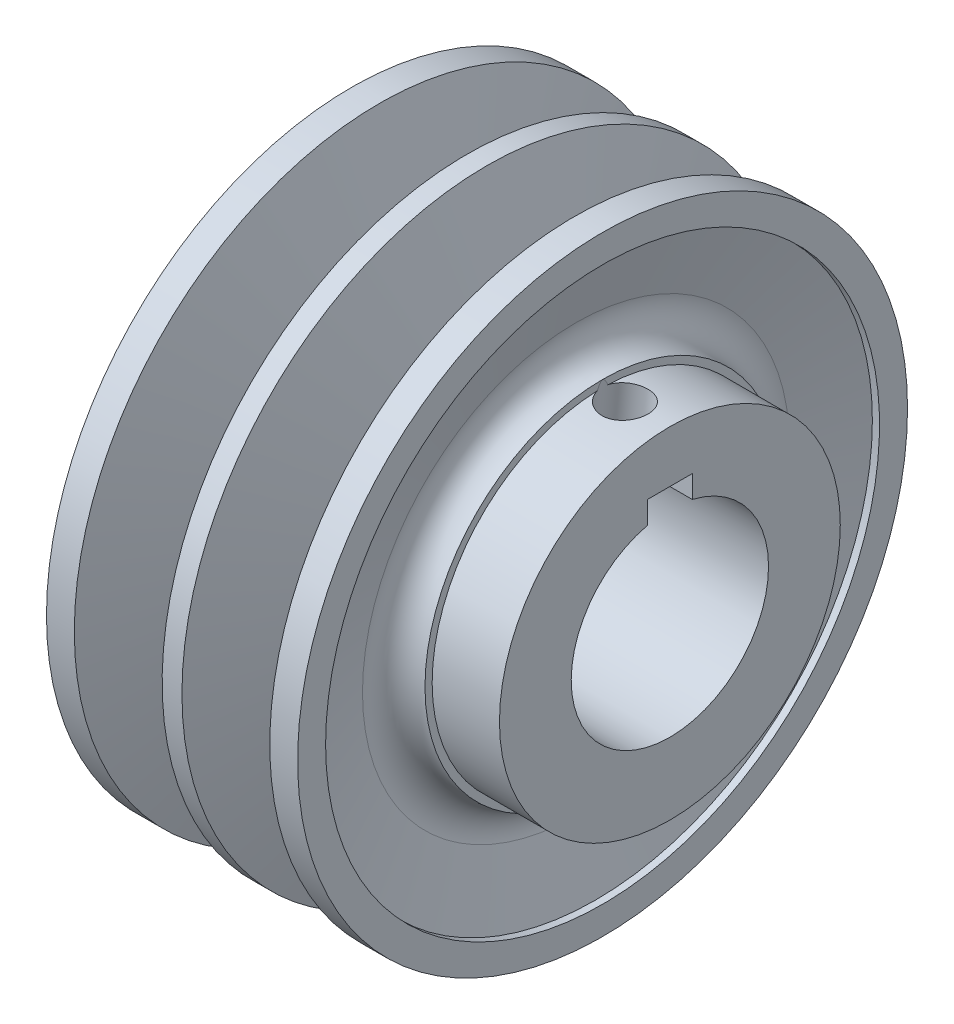
ISO-10303-21;
HEADER;
FILE_DESCRIPTION(('STEP AP214'),'2;1');
FILE_NAME('part.step','',(''),(''),'','','');
FILE_SCHEMA(('AUTOMOTIVE_DESIGN { 1 0 10303 214 1 1 1 1 }'));
ENDSEC;
DATA;
#1=APPLICATION_CONTEXT('core data for automotive mechanical design processes');
#2=APPLICATION_PROTOCOL_DEFINITION('international standard','automotive_design',2000,#1);
#3=PRODUCT_CONTEXT('',#1,'mechanical');
#4=PRODUCT('Part','Part','',(#3));
#5=PRODUCT_RELATED_PRODUCT_CATEGORY('part','',(#4));
#6=PRODUCT_DEFINITION_FORMATION('','',#4);
#7=PRODUCT_DEFINITION_CONTEXT('part definition',#1,'design');
#8=PRODUCT_DEFINITION('design','',#6,#7);
#9=PRODUCT_DEFINITION_SHAPE('','',#8);
#10=(LENGTH_UNIT() NAMED_UNIT(*) SI_UNIT(.MILLI.,.METRE.));
#11=(NAMED_UNIT(*) PLANE_ANGLE_UNIT() SI_UNIT($,.RADIAN.));
#12=(NAMED_UNIT(*) SI_UNIT($,.STERADIAN.) SOLID_ANGLE_UNIT());
#13=UNCERTAINTY_MEASURE_WITH_UNIT(LENGTH_MEASURE(1.E-05),#10,'distance_accuracy_value','');
#14=(GEOMETRIC_REPRESENTATION_CONTEXT(3) GLOBAL_UNCERTAINTY_ASSIGNED_CONTEXT((#13)) GLOBAL_UNIT_ASSIGNED_CONTEXT((#10,
#11,#12)) REPRESENTATION_CONTEXT('',''));
#15=CARTESIAN_POINT('',(0.,0.,0.));
#16=DIRECTION('',(0.,0.,1.));
#17=DIRECTION('',(1.,0.,0.));
#18=AXIS2_PLACEMENT_3D('',#15,#16,#17);
#19=CARTESIAN_POINT('',(28.1813000000001,20.9742764454679,-3.96874999999997));
#20=DIRECTION('',(0.,1.,0.));
#21=DIRECTION('',(0.,0.,1.));
#22=AXIS2_PLACEMENT_3D('',#19,#20,#21);
#23=PLANE('',#22);
#24=DIRECTION('',(-1.,0.,0.));
#25=VECTOR('',#24,1.);
#26=CARTESIAN_POINT('',(28.1813000000001,20.9742764454679,-3.96874999999997));
#27=LINE('',#26,#25);
#28=CARTESIAN_POINT('',(-9.34036105443681,20.9742764454679,-3.96874999999997));
#29=VERTEX_POINT('',#28);
#30=CARTESIAN_POINT('',(18.561882287455,20.9742764454679,-3.96874999999997));
#31=VERTEX_POINT('',#30);
#32=EDGE_CURVE('E172',#29,#31,#27,.F.);
#33=ORIENTED_EDGE('',*,*,#32,.T.);
#34=CARTESIAN_POINT('',(19.4399346010358,20.9742764454679,0.));
#35=DIRECTION('',(0.,1.,0.));
#36=DIRECTION('',(1.,0.,0.));
#37=AXIS2_PLACEMENT_3D('',#34,#35,#36);
#38=ELLIPSE('',#37,4.07952381977618,4.06400000000001);
#39=CARTESIAN_POINT('',(18.561882287455,20.9742764454681,3.96875000000008));
#40=VERTEX_POINT('',#39);
#41=EDGE_CURVE('E121',#31,#40,#38,.T.);
#42=ORIENTED_EDGE('',*,*,#41,.T.);
#43=DIRECTION('',(1.,0.,0.));
#44=VECTOR('',#43,1.);
#45=CARTESIAN_POINT('',(28.1813,20.9742764454681,3.96875000000008));
#46=LINE('',#45,#44);
#47=CARTESIAN_POINT('',(-9.34036105443692,20.9742764454679,3.96875000000008));
#48=VERTEX_POINT('',#47);
#49=EDGE_CURVE('E138',#40,#48,#46,.F.);
#50=ORIENTED_EDGE('',*,*,#49,.T.);
#51=CARTESIAN_POINT('',(-9.34036105443693,20.9742764454679,3.96875000000008));
#52=CARTESIAN_POINT('',(-9.30817368593488,20.9742764454679,3.02643982037648));
#53=CARTESIAN_POINT('',(-9.292391892862,20.9742764454679,1.98463764473822));
#54=CARTESIAN_POINT('',(-9.27768482473013,20.9742764454679,1.01378119602618));
#55=CARTESIAN_POINT('',(-9.27768482473013,20.9742764454679,0.));
#56=CARTESIAN_POINT('',(-9.27768482473013,20.9742764454679,-1.01378119602609));
#57=CARTESIAN_POINT('',(-9.292391892862,20.9742764454679,-1.98463764473813));
#58=CARTESIAN_POINT('',(-9.30817368593488,20.9742764454679,-3.02643982037637));
#59=CARTESIAN_POINT('',(-9.34036105443693,20.9742764454679,-3.96874999999998));
#60=B_SPLINE_CURVE_WITH_KNOTS('',2,(#51,#52,#53,#54,#55,#56,#57,#58,#59),.UNSPECIFIED.,.F.,.F.,
(3,2,2,2,3),(0.,0.25,0.5,0.75,1.),.UNSPECIFIED.);
#61=EDGE_CURVE('E183',#48,#29,#60,.T.);
#62=ORIENTED_EDGE('',*,*,#61,.T.);
#63=EDGE_LOOP('',(#33,#42,#50,#62));
#64=FACE_BOUND('',#63,.T.);
#65=ADVANCED_FACE('F49',(#64),#23,.F.);
#66=CARTESIAN_POINT('',(-4.20370000000192,0.,0.));
#67=DIRECTION('',(-1.,0.,0.));
#68=DIRECTION('',(0.,0.,1.));
#69=AXIS2_PLACEMENT_3D('',#66,#67,#68);
#70=CONICAL_SURFACE('',#69,53.9749999999994,1.27409035395562);
#71=CARTESIAN_POINT('',(0.649774568156181,0.,0.));
#72=DIRECTION('',(-1.,0.,0.));
#73=DIRECTION('',(0.,0.,1.));
#74=AXIS2_PLACEMENT_3D('',#71,#72,#73);
#75=CIRCLE('',#74,38.1);
#76=CARTESIAN_POINT('',(0.649774568156181,0.,38.1000000000001));
#77=VERTEX_POINT('',#76);
#78=EDGE_CURVE('E421',#77,#77,#75,.F.);
#79=ORIENTED_EDGE('',*,*,#78,.F.);
#80=EDGE_LOOP('',(#79));
#81=FACE_BOUND('',#80,.T.);
#82=CARTESIAN_POINT('',(-4.20370000000003,0.,0.));
#83=DIRECTION('',(1.,0.,0.));
#84=DIRECTION('',(0.,0.,-1.));
#85=AXIS2_PLACEMENT_3D('',#82,#83,#84);
#86=CIRCLE('',#85,53.975);
#87=CARTESIAN_POINT('',(-4.20370000000003,0.,-53.9750000000001));
#88=VERTEX_POINT('',#87);
#89=EDGE_CURVE('E414',#88,#88,#86,.F.);
#90=ORIENTED_EDGE('',*,*,#89,.F.);
#91=EDGE_LOOP('',(#90));
#92=FACE_BOUND('',#91,.T.);
#93=ADVANCED_FACE('F350',(#81,#92),#70,.T.);
#94=CARTESIAN_POINT('',(-30.9994300000001,0.,0.));
#95=DIRECTION('',(1.,0.,0.));
#96=DIRECTION('',(0.,0.,-1.));
#97=AXIS2_PLACEMENT_3D('',#94,#95,#96);
#98=CYLINDRICAL_SURFACE('',#97,53.975);
#99=ORIENTED_EDGE('',*,*,#89,.T.);
#100=EDGE_LOOP('',(#99));
#101=FACE_BOUND('',#100,.T.);
#102=CARTESIAN_POINT('',(-7.70889999999735,0.,0.));
#103=DIRECTION('',(1.,0.,0.));
#104=DIRECTION('',(0.,-1.,0.));
#105=AXIS2_PLACEMENT_3D('',#102,#103,#104);
#106=CIRCLE('',#105,53.9749999999992);
#107=CARTESIAN_POINT('',(-7.70889999999735,-53.9749999999993,0.));
#108=VERTEX_POINT('',#107);
#109=EDGE_CURVE('E417',#108,#108,#106,.F.);
#110=ORIENTED_EDGE('',*,*,#109,.F.);
#111=EDGE_LOOP('',(#110));
#112=FACE_BOUND('',#111,.T.);
#113=ADVANCED_FACE('F354',(#101,#112),#98,.T.);
#114=CARTESIAN_POINT('',(30.9994300000001,0.,0.));
#115=DIRECTION('',(-1.,0.,0.));
#116=DIRECTION('',(0.,0.,1.));
#117=AXIS2_PLACEMENT_3D('',#114,#115,#116);
#118=CYLINDRICAL_SURFACE('',#117,38.1);
#119=ORIENTED_EDGE('',*,*,#78,.T.);
#120=EDGE_LOOP('',(#119));
#121=FACE_BOUND('',#120,.T.);
#122=CARTESIAN_POINT('',(6.48762543184245,0.,0.));
#123=DIRECTION('',(1.,0.,0.));
#124=DIRECTION('',(0.,-1.,0.));
#125=AXIS2_PLACEMENT_3D('',#122,#123,#124);
#126=CIRCLE('',#125,38.1000000000001);
#127=CARTESIAN_POINT('',(6.48762543184245,-38.1000000000002,0.));
#128=VERTEX_POINT('',#127);
#129=EDGE_CURVE('E420',#128,#128,#126,.T.);
#130=ORIENTED_EDGE('',*,*,#129,.F.);
#131=EDGE_LOOP('',(#130));
#132=FACE_BOUND('',#131,.T.);
#133=ADVANCED_FACE('F402',(#121,#132),#118,.T.);
#134=CARTESIAN_POINT('',(-7.70889999999735,0.,0.));
#135=DIRECTION('',(1.,0.,0.));
#136=DIRECTION('',(0.,0.,-1.));
#137=AXIS2_PLACEMENT_3D('',#134,#135,#136);
#138=CONICAL_SURFACE('',#137,53.9749999999992,1.27409035395562);
#139=CARTESIAN_POINT('',(-12.5623745681572,0.,0.));
#140=DIRECTION('',(-1.,0.,0.));
#141=DIRECTION('',(0.,0.,1.));
#142=AXIS2_PLACEMENT_3D('',#139,#140,#141);
#143=CIRCLE('',#142,38.1);
#144=CARTESIAN_POINT('',(-12.5623745681572,0.,38.1000000000001));
#145=VERTEX_POINT('',#144);
#146=EDGE_CURVE('E428',#145,#145,#143,.T.);
#147=ORIENTED_EDGE('',*,*,#146,.F.);
#148=EDGE_LOOP('',(#147));
#149=FACE_BOUND('',#148,.T.);
#150=ORIENTED_EDGE('',*,*,#109,.T.);
#151=EDGE_LOOP('',(#150));
#152=FACE_BOUND('',#151,.T.);
#153=ADVANCED_FACE('F398',(#149,#152),#138,.T.);
#154=CARTESIAN_POINT('',(11.3411000000027,0.,0.));
#155=DIRECTION('',(1.,0.,0.));
#156=DIRECTION('',(0.,0.,-1.));
#157=AXIS2_PLACEMENT_3D('',#154,#155,#156);
#158=CONICAL_SURFACE('',#157,53.9749999999992,1.27409035395562);
#159=ORIENTED_EDGE('',*,*,#129,.T.);
#160=EDGE_LOOP('',(#159));
#161=FACE_BOUND('',#160,.T.);
#162=CARTESIAN_POINT('',(11.3411,0.,0.));
#163=DIRECTION('',(1.,0.,0.));
#164=DIRECTION('',(0.,0.,-1.));
#165=AXIS2_PLACEMENT_3D('',#162,#163,#164);
#166=CIRCLE('',#165,53.975);
#167=CARTESIAN_POINT('',(11.3411,0.,-53.9750000000001));
#168=VERTEX_POINT('',#167);
#169=EDGE_CURVE('E539',#168,#168,#166,.T.);
#170=ORIENTED_EDGE('',*,*,#169,.F.);
#171=EDGE_LOOP('',(#170));
#172=FACE_BOUND('',#171,.T.);
#173=ADVANCED_FACE('F394',(#161,#172),#158,.T.);
#174=CARTESIAN_POINT('',(30.9994300000001,0.,0.));
#175=DIRECTION('',(-1.,0.,0.));
#176=DIRECTION('',(0.,0.,1.));
#177=AXIS2_PLACEMENT_3D('',#174,#175,#176);
#178=CYLINDRICAL_SURFACE('',#177,38.1);
#179=ORIENTED_EDGE('',*,*,#146,.T.);
#180=EDGE_LOOP('',(#179));
#181=FACE_BOUND('',#180,.T.);
#182=CARTESIAN_POINT('',(-18.4002254318425,1.11022302462516E-13,1.11022302462516E-13));
#183=DIRECTION('',(-1.,0.,0.));
#184=DIRECTION('',(0.,1.,0.));
#185=AXIS2_PLACEMENT_3D('',#182,#183,#184);
#186=CIRCLE('',#185,38.1000000000001);
#187=CARTESIAN_POINT('',(-18.4002254318425,38.1000000000003,1.13137277324427E-13));
#188=VERTEX_POINT('',#187);
#189=EDGE_CURVE('E530',#188,#188,#186,.T.);
#190=ORIENTED_EDGE('',*,*,#189,.F.);
#191=EDGE_LOOP('',(#190));
#192=FACE_BOUND('',#191,.T.);
#193=ADVANCED_FACE('F390',(#181,#192),#178,.T.);
#194=CARTESIAN_POINT('',(-30.9994300000001,0.,0.));
#195=DIRECTION('',(1.,0.,0.));
#196=DIRECTION('',(0.,0.,-1.));
#197=AXIS2_PLACEMENT_3D('',#194,#195,#196);
#198=CYLINDRICAL_SURFACE('',#197,53.975);
#199=CARTESIAN_POINT('',(16.2687,0.,0.));
#200=DIRECTION('',(1.,0.,0.));
#201=DIRECTION('',(0.,0.,-1.));
#202=AXIS2_PLACEMENT_3D('',#199,#200,#201);
#203=CIRCLE('',#202,53.975);
#204=CARTESIAN_POINT('',(16.2687,0.,-53.9750000000001));
#205=VERTEX_POINT('',#204);
#206=EDGE_CURVE('E520',#205,#205,#203,.F.);
#207=ORIENTED_EDGE('',*,*,#206,.T.);
#208=EDGE_LOOP('',(#207));
#209=FACE_BOUND('',#208,.T.);
#210=ORIENTED_EDGE('',*,*,#169,.T.);
#211=EDGE_LOOP('',(#210));
#212=FACE_BOUND('',#211,.T.);
#213=ADVANCED_FACE('F386',(#209,#212),#198,.T.);
#214=CARTESIAN_POINT('',(-23.2537000000026,0.,0.));
#215=DIRECTION('',(-1.,0.,0.));
#216=DIRECTION('',(0.,0.,1.));
#217=AXIS2_PLACEMENT_3D('',#214,#215,#216);
#218=CONICAL_SURFACE('',#217,53.9749999999992,1.27409035395562);
#219=ORIENTED_EDGE('',*,*,#189,.T.);
#220=EDGE_LOOP('',(#219));
#221=FACE_BOUND('',#220,.T.);
#222=CARTESIAN_POINT('',(-23.2537,0.,0.));
#223=DIRECTION('',(-1.,0.,0.));
#224=DIRECTION('',(0.,0.,1.));
#225=AXIS2_PLACEMENT_3D('',#222,#223,#224);
#226=CIRCLE('',#225,53.975);
#227=CARTESIAN_POINT('',(-23.2537,0.,53.9750000000001));
#228=VERTEX_POINT('',#227);
#229=EDGE_CURVE('E440',#228,#228,#226,.T.);
#230=ORIENTED_EDGE('',*,*,#229,.F.);
#231=EDGE_LOOP('',(#230));
#232=FACE_BOUND('',#231,.T.);
#233=ADVANCED_FACE('F382',(#221,#232),#218,.T.);
#234=CARTESIAN_POINT('',(16.2687,0.,0.));
#235=DIRECTION('',(-1.,0.,0.));
#236=DIRECTION('',(0.,0.,1.));
#237=AXIS2_PLACEMENT_3D('',#234,#235,#236);
#238=PLANE('',#237);
#239=CARTESIAN_POINT('',(16.2687,0.,0.));
#240=DIRECTION('',(-1.,0.,0.));
#241=DIRECTION('',(0.,0.,1.));
#242=AXIS2_PLACEMENT_3D('',#239,#240,#241);
#243=CIRCLE('',#242,49.022);
#244=CARTESIAN_POINT('',(16.2687,0.,49.0220000000001));
#245=VERTEX_POINT('',#244);
#246=EDGE_CURVE('E213',#245,#245,#243,.T.);
#247=ORIENTED_EDGE('',*,*,#246,.T.);
#248=EDGE_LOOP('',(#247));
#249=FACE_BOUND('',#248,.T.);
#250=ORIENTED_EDGE('',*,*,#206,.F.);
#251=EDGE_LOOP('',(#250));
#252=FACE_BOUND('',#251,.T.);
#253=ADVANCED_FACE('F378',(#249,#252),#238,.F.);
#254=CARTESIAN_POINT('',(18.4912,0.,0.));
#255=DIRECTION('',(-1.,0.,0.));
#256=DIRECTION('',(0.,0.,1.));
#257=AXIS2_PLACEMENT_3D('',#254,#255,#256);
#258=CYLINDRICAL_SURFACE('',#257,49.022);
#259=CARTESIAN_POINT('',(14.9987000000041,0.,0.));
#260=DIRECTION('',(1.,0.,0.));
#261=DIRECTION('',(0.,-1.,0.));
#262=AXIS2_PLACEMENT_3D('',#259,#260,#261);
#263=CIRCLE('',#262,49.0219999999987);
#264=CARTESIAN_POINT('',(14.9987000000041,-49.0219999999988,0.));
#265=VERTEX_POINT('',#264);
#266=EDGE_CURVE('E537',#265,#265,#263,.F.);
#267=ORIENTED_EDGE('',*,*,#266,.T.);
#268=EDGE_LOOP('',(#267));
#269=FACE_BOUND('',#268,.T.);
#270=ORIENTED_EDGE('',*,*,#246,.F.);
#271=EDGE_LOOP('',(#270));
#272=FACE_BOUND('',#271,.T.);
#273=ADVANCED_FACE('F374',(#269,#272),#258,.F.);
#274=CARTESIAN_POINT('',(14.9987000000041,0.,0.));
#275=DIRECTION('',(1.,0.,0.));
#276=DIRECTION('',(0.,0.,-1.));
#277=AXIS2_PLACEMENT_3D('',#274,#275,#276);
#278=CONICAL_SURFACE('',#277,49.0219999999987,1.27409035395562);
#279=CARTESIAN_POINT('',(11.5646348892043,0.,0.));
#280=DIRECTION('',(-1.,0.,0.));
#281=DIRECTION('',(0.,1.,0.));
#282=AXIS2_PLACEMENT_3D('',#279,#280,#281);
#283=CIRCLE('',#282,37.7896791403015);
#284=CARTESIAN_POINT('',(11.5646348892043,37.7896791403015,0.));
#285=VERTEX_POINT('',#284);
#286=EDGE_CURVE('E206',#285,#285,#283,.T.);
#287=ORIENTED_EDGE('',*,*,#286,.T.);
#288=EDGE_LOOP('',(#287));
#289=FACE_BOUND('',#288,.T.);
#290=ORIENTED_EDGE('',*,*,#266,.F.);
#291=EDGE_LOOP('',(#290));
#292=FACE_BOUND('',#291,.T.);
#293=ADVANCED_FACE('F367',(#289,#292),#278,.F.);
#294=CARTESIAN_POINT('',(16.2687,0.,0.));
#295=DIRECTION('',(-1.,0.,0.));
#296=DIRECTION('',(0.,1.,0.));
#297=AXIS2_PLACEMENT_3D('',#294,#295,#296);
#298=TOROIDAL_SURFACE('',#297,36.3515021083312,4.9190021083439);
#299=ORIENTED_EDGE('',*,*,#286,.F.);
#300=EDGE_LOOP('',(#299));
#301=FACE_BOUND('',#300,.T.);
#302=CARTESIAN_POINT('',(16.2687,0.,0.));
#303=DIRECTION('',(-1.,0.,0.));
#304=DIRECTION('',(0.,0.,1.));
#305=AXIS2_PLACEMENT_3D('',#302,#303,#304);
#306=CIRCLE('',#305,31.4324999999873);
#307=CARTESIAN_POINT('',(16.2687,0.,31.4324999999874));
#308=VERTEX_POINT('',#307);
#309=EDGE_CURVE('E198',#308,#308,#306,.T.);
#310=ORIENTED_EDGE('',*,*,#309,.T.);
#311=EDGE_LOOP('',(#310));
#312=FACE_BOUND('',#311,.T.);
#313=ADVANCED_FACE('F362',(#301,#312),#298,.F.);
#314=CARTESIAN_POINT('',(16.2687,0.,0.));
#315=DIRECTION('',(-1.,0.,0.));
#316=DIRECTION('',(0.,0.,1.));
#317=AXIS2_PLACEMENT_3D('',#314,#315,#316);
#318=PLANE('',#317);
#319=CARTESIAN_POINT('',(16.2687,-15.273100908694,0.));
#320=DIRECTION('',(-1.,0.,0.));
#321=DIRECTION('',(0.,1.,0.));
#322=AXIS2_PLACEMENT_3D('',#319,#320,#321);
#323=ELLIPSE('',#322,46.6291706303993,4.06400000000001);
#324=CARTESIAN_POINT('',(16.2687,30.1484997684309,0.918894968389483));
#325=VERTEX_POINT('',#324);
#326=CARTESIAN_POINT('',(16.2687,30.1484997684309,-0.918894968389372));
#327=VERTEX_POINT('',#326);
#328=EDGE_CURVE('E63',#325,#327,#323,.T.);
#329=ORIENTED_EDGE('',*,*,#328,.T.);
#330=CARTESIAN_POINT('',(16.2687,0.,0.));
#331=DIRECTION('',(-1.,0.,0.));
#332=DIRECTION('',(0.,0.,1.));
#333=AXIS2_PLACEMENT_3D('',#330,#331,#332);
#334=CIRCLE('',#333,30.1625);
#335=EDGE_CURVE('E189',#325,#327,#334,.F.);
#336=ORIENTED_EDGE('',*,*,#335,.F.);
#337=EDGE_LOOP('',(#329,#336));
#338=FACE_BOUND('',#337,.T.);
#339=ORIENTED_EDGE('',*,*,#309,.F.);
#340=EDGE_LOOP('',(#339));
#341=FACE_BOUND('',#340,.T.);
#342=ADVANCED_FACE('F357',(#338,#341),#318,.F.);
#343=CARTESIAN_POINT('',(28.1813,20.9742764454681,3.96875000000008));
#344=VERTEX_POINT('',#343);
#345=CARTESIAN_POINT('',(20.3179869146164,20.9742764454681,3.96875000000008));
#346=VERTEX_POINT('',#345);
#347=EDGE_CURVE('E135',#344,#346,#46,.F.);
#348=ORIENTED_EDGE('',*,*,#347,.T.);
#349=CARTESIAN_POINT('',(20.3179869146164,20.9742764454679,-3.96874999999997));
#350=VERTEX_POINT('',#349);
#351=EDGE_CURVE('E113',#346,#350,#38,.T.);
#352=ORIENTED_EDGE('',*,*,#351,.T.);
#353=CARTESIAN_POINT('',(28.1813000000001,20.9742764454679,-3.96874999999997));
#354=VERTEX_POINT('',#353);
#355=EDGE_CURVE('E173',#350,#354,#27,.F.);
#356=ORIENTED_EDGE('',*,*,#355,.T.);
#357=DIRECTION('',(0.,0.,-1.));
#358=VECTOR('',#357,1.);
#359=CARTESIAN_POINT('',(28.1813000000001,20.9742764454679,0.));
#360=LINE('',#359,#358);
#361=EDGE_CURVE('E143',#344,#354,#360,.T.);
#362=ORIENTED_EDGE('',*,*,#361,.F.);
#363=EDGE_LOOP('',(#348,#352,#356,#362));
#364=FACE_BOUND('',#363,.T.);
#365=ADVANCED_FACE('F141',(#364),#23,.F.);
#366=CARTESIAN_POINT('',(30.9994300000001,0.,0.));
#367=DIRECTION('',(-1.,0.,0.));
#368=DIRECTION('',(0.,0.,1.));
#369=AXIS2_PLACEMENT_3D('',#366,#367,#368);
#370=CYLINDRICAL_SURFACE('',#369,30.1625);
#371=CARTESIAN_POINT('',(16.2687,30.1484997684309,0.918894968389483));
#372=CARTESIAN_POINT('',(16.2943331071107,30.1451118034446,1.03023263741645));
#373=CARTESIAN_POINT('',(16.3246513629594,30.1411291866993,1.1404708611589));
#374=CARTESIAN_POINT('',(16.3943980232416,30.1321102009477,1.35797640284445));
#375=CARTESIAN_POINT('',(16.4338259547372,30.1270738866464,1.46524387469344));
#376=CARTESIAN_POINT('',(16.5215067779664,30.1160861552453,1.67598090862075));
#377=CARTESIAN_POINT('',(16.5697540688579,30.1101353193034,1.77945283131801));
#378=CARTESIAN_POINT('',(16.6747549170082,30.0974851990848,1.98193740564621));
#379=CARTESIAN_POINT('',(16.7315083836395,30.0907859227825,2.08095010477253));
#380=CARTESIAN_POINT('',(16.8531510197819,30.076824953956,2.27384339069589));
#381=CARTESIAN_POINT('',(16.9180425285548,30.0695630999505,2.36772249066419));
#382=CARTESIAN_POINT('',(17.0555275193798,30.0546809721792,2.54968533843365));
#383=CARTESIAN_POINT('',(17.1281238392623,30.0470605669313,2.6377669314135));
#384=CARTESIAN_POINT('',(17.280453273968,30.0316840928631,2.80742040267172));
#385=CARTESIAN_POINT('',(17.3601822097115,30.0239281055978,2.88899604054508));
#386=CARTESIAN_POINT('',(17.5262910103324,30.0084934086342,3.04514181938815));
#387=CARTESIAN_POINT('',(17.6126733114535,30.0008147284182,3.11970937182459));
#388=CARTESIAN_POINT('',(17.7913301699447,29.9857672484162,3.26116891737176));
#389=CARTESIAN_POINT('',(17.883596013398,29.9783980159854,3.32807186933195));
#390=CARTESIAN_POINT('',(18.0735195810497,29.9641650021144,3.45387208681127));
#391=CARTESIAN_POINT('',(18.1711792850269,29.9573014084518,3.51276638498033));
#392=CARTESIAN_POINT('',(18.3711417825259,29.9442804874145,3.6220854977355));
#393=CARTESIAN_POINT('',(18.473443380445,29.9381229795997,3.67251247767763));
#394=CARTESIAN_POINT('',(18.6820215224175,29.926686031557,3.76457479226739));
#395=CARTESIAN_POINT('',(18.7882995135151,29.9214069148659,3.80620688902114));
#396=CARTESIAN_POINT('',(19.0034754211778,29.9119046562275,3.88017401890646));
#397=CARTESIAN_POINT('',(19.1123570348728,29.9076762183189,3.91255580742419));
#398=CARTESIAN_POINT('',(19.3325268936588,29.9003574278494,3.96810002704546));
#399=CARTESIAN_POINT('',(19.4438160081257,29.8972674939312,3.99125906707628));
#400=CARTESIAN_POINT('',(19.6679175082534,29.8923146044684,4.02818590331722));
#401=CARTESIAN_POINT('',(19.7807291935637,29.8904511031855,4.04195787668359));
#402=CARTESIAN_POINT('',(20.0071609729204,29.8879979999263,4.06005717068471));
#403=CARTESIAN_POINT('',(20.1207813509294,29.8874088700675,4.06438099106034));
#404=CARTESIAN_POINT('',(20.3479539859084,29.8875197426459,4.06356674140942));
#405=CARTESIAN_POINT('',(20.4615062527403,29.8882192873075,4.05843203133533));
#406=CARTESIAN_POINT('',(20.6877929596385,29.890880322059,4.03878198842694));
#407=CARTESIAN_POINT('',(20.8005270841934,29.8928422752933,4.02426321281826));
#408=CARTESIAN_POINT('',(21.1362487413211,29.9005454432195,3.96678903089917));
#409=CARTESIAN_POINT('',(21.3569790184728,29.9081042398021,3.90991465660399));
#410=CARTESIAN_POINT('',(21.7881705018476,29.9273192435846,3.76000845654572));
#411=CARTESIAN_POINT('',(21.9984941893861,29.9390190477124,3.66659075268218));
#412=CARTESIAN_POINT('',(22.4006749230945,29.9651758127917,3.44628933498008));
#413=CARTESIAN_POINT('',(22.5925304129056,29.9796330058093,3.31940280400825));
#414=CARTESIAN_POINT('',(22.9545856216991,30.0098752151514,3.0339057708677));
#415=CARTESIAN_POINT('',(23.1245030395373,30.0256738886211,2.87493853965753));
#416=CARTESIAN_POINT('',(23.4350766604723,30.0566565649437,2.5305394495642));
#417=CARTESIAN_POINT('',(23.5757331115165,30.0718405730043,2.34510781495382));
#418=CARTESIAN_POINT('',(23.8229643052827,30.0997966185339,1.95369479673635));
#419=CARTESIAN_POINT('',(23.9296819047618,30.1125786708028,1.74780446911196));
#420=CARTESIAN_POINT('',(24.1063930122588,30.1343324127586,1.32063649089117));
#421=CARTESIAN_POINT('',(24.1763916316021,30.1433046327456,1.09936098678878));
#422=CARTESIAN_POINT('',(24.2762618265456,30.1562525692229,0.652508793287112));
#423=CARTESIAN_POINT('',(24.3069182230205,30.1603259040193,0.42711027843038));
#424=CARTESIAN_POINT('',(24.3296539728966,30.1633382166751,-0.0256478782774239));
#425=CARTESIAN_POINT('',(24.3217372419821,30.1622777156871,-0.253007318729604));
#426=CARTESIAN_POINT('',(24.268012321168,30.1551990753891,-0.699688101863853));
#427=CARTESIAN_POINT('',(24.2227662932189,30.1492544935609,-0.919078595010619));
#428=CARTESIAN_POINT('',(24.0965943291362,30.1331618673279,-1.34717441425117));
#429=CARTESIAN_POINT('',(24.0156672351177,30.1230136865131,-1.55587939334441));
#430=CARTESIAN_POINT('',(23.8199487051917,30.0995339609517,-1.95843173140156));
#431=CARTESIAN_POINT('',(23.7049147595857,30.0861797544219,-2.1521597200409));
#432=CARTESIAN_POINT('',(23.4446337703623,30.0577755470748,-2.51798650050915));
#433=CARTESIAN_POINT('',(23.2993831461879,30.0427253453858,-2.69008272517897));
#434=CARTESIAN_POINT('',(22.9794052487694,30.0122200524611,-3.01159875466498));
#435=CARTESIAN_POINT('',(22.8041223699209,29.9967631020294,-3.16046562650514));
#436=CARTESIAN_POINT('',(22.4311980587304,29.9674702691779,-3.42712431506414));
#437=CARTESIAN_POINT('',(22.2335547956372,29.9536345196826,-3.54491358467678));
#438=CARTESIAN_POINT('',(21.8187513783648,29.9289770503114,-3.74744264767992));
#439=CARTESIAN_POINT('',(21.6013794371501,29.9181948702047,-3.8317541046673));
#440=CARTESIAN_POINT('',(21.1553896536294,29.9011368745718,-3.96267818254589));
#441=CARTESIAN_POINT('',(20.9267722323742,29.8948608904627,-4.00929221375774));
#442=CARTESIAN_POINT('',(20.4663779690115,29.8875995754057,-4.06307085248197));
#443=CARTESIAN_POINT('',(20.234631866746,29.8865796593378,-4.07049334969313));
#444=CARTESIAN_POINT('',(19.7732507685961,29.8898890684815,-4.046119955402));
#445=CARTESIAN_POINT('',(19.5436156079205,29.894217972501,-4.0143271519025));
#446=CARTESIAN_POINT('',(19.0962168513386,29.9076529841772,-3.91295841687835));
#447=CARTESIAN_POINT('',(18.8783358781866,29.916694699578,-3.84389133309365));
#448=CARTESIAN_POINT('',(18.4574534029514,29.9384992402336,-3.67018769048772));
#449=CARTESIAN_POINT('',(18.2544508737727,29.9512618083254,-3.56555358976185));
#450=CARTESIAN_POINT('',(17.8699598093593,29.9789989693491,-3.32425545926034));
#451=CARTESIAN_POINT('',(17.6883792445269,29.9939634291787,-3.18773655710148));
#452=CARTESIAN_POINT('',(17.3505636780119,30.0244859290546,-2.88608938332717));
#453=CARTESIAN_POINT('',(17.194336904911,30.0400441597938,-2.72095185934287));
#454=CARTESIAN_POINT('',(16.9820814503489,30.0625466638029,-2.45513806382675));
#455=CARTESIAN_POINT('',(16.9148488112461,30.0699284198572,-2.36322418632229));
#456=CARTESIAN_POINT('',(16.7883399946728,30.0841965752678,-2.17405154752542));
#457=CARTESIAN_POINT('',(16.7290608778763,30.0910831571828,-2.07679477959924));
#458=CARTESIAN_POINT('',(16.6189233880635,30.1041609010808,-1.87772389085199));
#459=CARTESIAN_POINT('',(16.5680563720098,30.1103527747132,-1.77591458595356));
#460=CARTESIAN_POINT('',(16.4750261128271,30.1218747650702,-1.568392607485));
#461=CARTESIAN_POINT('',(16.4328587519648,30.1272052892298,-1.46268180863714));
#462=CARTESIAN_POINT('',(16.3700527688683,30.1352498884385,-1.28384295182927));
#463=CARTESIAN_POINT('',(16.3469218185763,30.1382440241332,-1.21159188174024));
#464=CARTESIAN_POINT('',(16.304748507569,30.1437442260484,-1.06602037273632));
#465=CARTESIAN_POINT('',(16.285699308148,30.1462511079651,-0.992701945791005));
#466=CARTESIAN_POINT('',(16.2687,30.1484997684309,-0.918894968389372));
#467=B_SPLINE_CURVE_WITH_KNOTS('',3,(#371,#372,#373,#374,#375,#376,#377,#378,#379,#380,#381,
#382,#383,#384,#385,#386,#387,#388,#389,#390,#391,#392,#393,#394,#395,#396,#397,#398,#399,#400,
#401,#402,#403,#404,#405,#406,#407,#408,#409,#410,#411,#412,#413,#414,#415,#416,#417,#418,#419,
#420,#421,#422,#423,#424,#425,#426,#427,#428,#429,#430,#431,#432,#433,#434,#435,#436,#437,#438,
#439,#440,#441,#442,#443,#444,#445,#446,#447,#448,#449,#450,#451,#452,#453,#454,#455,#456,#457,
#458,#459,#460,#461,#462,#463,#464,#465,#466),.UNSPECIFIED.,.F.,.F.,(4,2,2,2,2,2,2,2,2,2,2,2,2,
2,2,2,2,2,2,2,2,2,2,2,2,2,2,2,2,2,2,2,2,2,2,2,2,2,2,2,2,2,2,2,2,2,2,4),(0.,0.342796322784525,
0.685574852954748,1.02813644896754,1.37069439547873,1.71335103616641,2.05613432478668,
2.39871807199749,2.74142786399606,3.08364136693417,3.42598132263322,3.7682335976061,
4.11061165625001,4.45122725177078,4.79196797139773,5.13255696544966,5.47327211619713,
5.81386625808848,6.1545854262684,6.83536167321095,7.52352951110642,8.21175529185987,
8.90810342712052,9.60444566152399,10.2978167925049,10.9910913797741,11.670309456867,
12.3494585857473,13.0185628222976,13.6876887735225,14.3616914132109,15.0357739650892,
15.7240310406857,16.4123445080098,17.1092009385524,17.8060312973816,18.4982705784807,
19.1904553527849,19.8734213776991,20.5563402112951,21.2362092327531,21.916298466563,
22.2583207190156,22.6002162225429,22.9417582321955,23.2831382099273,23.5107946604418,
23.7380666523397),.UNSPECIFIED.);
#468=EDGE_CURVE('E128',#325,#327,#467,.T.);
#469=ORIENTED_EDGE('',*,*,#468,.F.);
#470=ORIENTED_EDGE('',*,*,#335,.T.);
#471=EDGE_LOOP('',(#469,#470));
#472=FACE_BOUND('',#471,.T.);
#473=CARTESIAN_POINT('',(28.1813,0.,0.));
#474=DIRECTION('',(-1.,0.,0.));
#475=DIRECTION('',(0.,0.,1.));
#476=AXIS2_PLACEMENT_3D('',#473,#474,#475);
#477=CIRCLE('',#476,30.1625);
#478=CARTESIAN_POINT('',(28.1813,0.,30.1625000000001));
#479=VERTEX_POINT('',#478);
#480=EDGE_CURVE('E209',#479,#479,#477,.F.);
#481=ORIENTED_EDGE('',*,*,#480,.F.);
#482=EDGE_LOOP('',(#481));
#483=FACE_BOUND('',#482,.T.);
#484=ADVANCED_FACE('F291',(#472,#483),#370,.T.);
#485=CARTESIAN_POINT('',(28.1813000000001,17.0055264454679,-3.96874999999997));
#486=DIRECTION('',(0.,0.,-1.));
#487=DIRECTION('',(-1.,0.,0.));
#488=AXIS2_PLACEMENT_3D('',#485,#486,#487);
#489=PLANE('',#488);
#490=ORIENTED_EDGE('',*,*,#32,.F.);
#491=CARTESIAN_POINT('',(-9.13130000000003,18.6336222569257,-3.96875));
#492=CARTESIAN_POINT('',(-9.13129980716753,18.7284515383369,-3.96875006522434));
#493=CARTESIAN_POINT('',(-9.13231601925126,18.823280924172,-3.96875085453562));
#494=CARTESIAN_POINT('',(-9.13640368549242,19.0138163692197,-3.96875304226));
#495=CARTESIAN_POINT('',(-9.13949499461615,19.1095220026917,-3.96875444651141));
#496=CARTESIAN_POINT('',(-9.14779526192906,19.3017625087664,-3.96875700282134));
#497=CARTESIAN_POINT('',(-9.15302427622307,19.3982965161631,-3.96875815232781));
#498=CARTESIAN_POINT('',(-9.16566157427449,19.5921434087423,-3.96875974659875));
#499=CARTESIAN_POINT('',(-9.1730901015147,19.6894549748045,-3.96876018456012));
#500=CARTESIAN_POINT('',(-9.19018752336033,19.8848037343832,-3.9687601902222));
#501=CARTESIAN_POINT('',(-9.19987683819843,19.982839141322,-3.96875974969659));
#502=CARTESIAN_POINT('',(-9.22155616518543,20.1795793818945,-3.96875816167146));
#503=CARTESIAN_POINT('',(-9.23356676192824,20.2782819478735,-3.96875700762656));
#504=CARTESIAN_POINT('',(-9.25994824485285,20.4762973322508,-3.96875445262553));
#505=CARTESIAN_POINT('',(-9.27433986847665,20.5756073885663,-3.96875304949136));
#506=CARTESIAN_POINT('',(-9.30554167044614,20.7747755506519,-3.96875084439634));
#507=CARTESIAN_POINT('',(-9.32237272275832,20.8746303865102,-3.9687500480389));
#508=CARTESIAN_POINT('',(-9.34036105443945,20.9742764454821,-3.96875));
#509=B_SPLINE_CURVE_WITH_KNOTS('',3,(#491,#492,#493,#494,#495,#496,#497,#498,#499,#500,#501,
#502,#503,#504,#505,#506,#507,#508),.UNSPECIFIED.,.F.,.F.,(4,2,2,2,2,2,2,2,4),(0.,
0.284482580095118,0.57172670036932,0.861729978693178,1.15449000895485,1.45000437560116,
1.74827066867777,2.04928649934742,2.35304951585982),.UNSPECIFIED.);
#510=CARTESIAN_POINT('',(-9.13129999999995,18.6336222569258,-3.96874999999997));
#511=VERTEX_POINT('',#510);
#512=EDGE_CURVE('E194',#511,#29,#509,.T.);
#513=ORIENTED_EDGE('',*,*,#512,.F.);
#514=DIRECTION('',(0.,1.,0.));
#515=VECTOR('',#514,1.);
#516=CARTESIAN_POINT('',(-9.13129999999995,17.0055264454679,-3.96874999999997));
#517=LINE('',#516,#515);
#518=CARTESIAN_POINT('',(-9.13129999999995,17.0055264454678,-3.96874999999985));
#519=VERTEX_POINT('',#518);
#520=EDGE_CURVE('E188',#519,#511,#517,.T.);
#521=ORIENTED_EDGE('',*,*,#520,.F.);
#522=DIRECTION('',(1.,0.,0.));
#523=VECTOR('',#522,1.);
#524=CARTESIAN_POINT('',(-30.9994299999999,17.0055264454677,-3.96874999999997));
#525=LINE('',#524,#523);
#526=CARTESIAN_POINT('',(28.1813000000001,17.0055264454678,-3.96874999999997));
#527=VERTEX_POINT('',#526);
#528=EDGE_CURVE('E314',#519,#527,#525,.T.);
#529=ORIENTED_EDGE('',*,*,#528,.T.);
#530=DIRECTION('',(0.,1.,0.));
#531=VECTOR('',#530,1.);
#532=CARTESIAN_POINT('',(28.1813,2.22044604925031E-13,-3.96874999999997));
#533=LINE('',#532,#531);
#534=EDGE_CURVE('E300',#354,#527,#533,.F.);
#535=ORIENTED_EDGE('',*,*,#534,.F.);
#536=ORIENTED_EDGE('',*,*,#355,.F.);
#537=EDGE_CURVE('E168',#31,#350,#27,.F.);
#538=ORIENTED_EDGE('',*,*,#537,.F.);
#539=EDGE_LOOP('',(#490,#513,#521,#529,#535,#536,#538));
#540=FACE_BOUND('',#539,.T.);
#541=ADVANCED_FACE('F288',(#540),#489,.F.);
#542=CARTESIAN_POINT('',(28.1813,0.,0.));
#543=DIRECTION('',(1.,0.,0.));
#544=DIRECTION('',(0.,0.,-1.));
#545=AXIS2_PLACEMENT_3D('',#542,#543,#544);
#546=PLANE('',#545);
#547=CARTESIAN_POINT('',(28.1813,0.,0.));
#548=DIRECTION('',(-1.,0.,0.));
#549=DIRECTION('',(0.,0.,1.));
#550=AXIS2_PLACEMENT_3D('',#547,#548,#549);
#551=CIRCLE('',#550,17.4625);
#552=CARTESIAN_POINT('',(28.1813,17.0055264454678,3.96874999999997));
#553=VERTEX_POINT('',#552);
#554=EDGE_CURVE('E446',#527,#553,#551,.T.);
#555=ORIENTED_EDGE('',*,*,#554,.T.);
#556=DIRECTION('',(0.,1.,0.));
#557=VECTOR('',#556,1.);
#558=CARTESIAN_POINT('',(28.1813,20.9742764454681,3.96875000000008));
#559=LINE('',#558,#557);
#560=EDGE_CURVE('E167',#553,#344,#559,.T.);
#561=ORIENTED_EDGE('',*,*,#560,.T.);
#562=ORIENTED_EDGE('',*,*,#361,.T.);
#563=ORIENTED_EDGE('',*,*,#534,.T.);
#564=EDGE_LOOP('',(#555,#561,#562,#563));
#565=FACE_BOUND('',#564,.T.);
#566=ORIENTED_EDGE('',*,*,#480,.T.);
#567=EDGE_LOOP('',(#566));
#568=FACE_BOUND('',#567,.T.);
#569=ADVANCED_FACE('F339',(#565,#568),#546,.T.);
#570=CARTESIAN_POINT('',(28.1813,20.9742764454681,3.96875000000008));
#571=DIRECTION('',(0.,0.,1.));
#572=DIRECTION('',(1.,0.,0.));
#573=AXIS2_PLACEMENT_3D('',#570,#571,#572);
#574=PLANE('',#573);
#575=DIRECTION('',(1.,0.,0.));
#576=VECTOR('',#575,1.);
#577=CARTESIAN_POINT('',(-30.9994299999999,17.0055264454677,3.96874999999997));
#578=LINE('',#577,#576);
#579=CARTESIAN_POINT('',(-9.13129999999995,17.0055264454678,3.96875000000008));
#580=VERTEX_POINT('',#579);
#581=EDGE_CURVE('E122',#553,#580,#578,.F.);
#582=ORIENTED_EDGE('',*,*,#581,.T.);
#583=DIRECTION('',(0.,1.,0.));
#584=VECTOR('',#583,1.);
#585=CARTESIAN_POINT('',(-9.13129999999995,20.9742764454679,3.96875000000008));
#586=LINE('',#585,#584);
#587=CARTESIAN_POINT('',(-9.13129999999995,18.6336222569258,3.96875000000019));
#588=VERTEX_POINT('',#587);
#589=EDGE_CURVE('E153',#588,#580,#586,.F.);
#590=ORIENTED_EDGE('',*,*,#589,.F.);
#591=CARTESIAN_POINT('',(-9.34036105443692,20.9742764454681,3.96875000000008));
#592=CARTESIAN_POINT('',(-9.32291269537842,20.8776214693733,3.96875000000008));
#593=CARTESIAN_POINT('',(-9.30655313531911,20.780770048053,3.96875000000008));
#594=CARTESIAN_POINT('',(-9.27603820429393,20.5868691503325,3.96875000000008));
#595=CARTESIAN_POINT('',(-9.26187957042868,20.4898201874409,3.96875000000008));
#596=CARTESIAN_POINT('',(-9.23575382366011,20.2955260253122,3.96875000000008));
#597=CARTESIAN_POINT('',(-9.22378454540174,20.1982811171969,3.96875000000008));
#598=CARTESIAN_POINT('',(-9.20202771423626,20.0035963870124,3.96875000000008));
#599=CARTESIAN_POINT('',(-9.19223908262678,19.9061566854787,3.96875000000008));
#600=CARTESIAN_POINT('',(-9.17483705505756,19.711083936566,3.96875000000008));
#601=CARTESIAN_POINT('',(-9.16722364425399,19.6134508905111,3.96875000000008));
#602=CARTESIAN_POINT('',(-9.15416843263602,19.4179905603692,3.96875000000008));
#603=CARTESIAN_POINT('',(-9.1487277227504,19.3201632034291,3.96875000000007));
#604=CARTESIAN_POINT('',(-9.14001764440404,19.1243142510423,3.96875000000008));
#605=CARTESIAN_POINT('',(-9.13675044478696,19.0262925591807,3.96875000000009));
#606=CARTESIAN_POINT('',(-9.13238989116234,18.8300546803826,3.96875000000007));
#607=CARTESIAN_POINT('',(-9.13129978364298,18.7318384212756,3.96875000000004));
#608=CARTESIAN_POINT('',(-9.13129999999995,18.6336222569274,3.96874999999997));
#609=B_SPLINE_CURVE_WITH_KNOTS('',3,(#591,#592,#593,#594,#595,#596,#597,#598,#599,#600,#601,
#602,#603,#604,#605,#606,#607,#608),.UNSPECIFIED.,.F.,.F.,(4,2,2,2,2,2,2,2,4),(0.,
0.294645386762071,0.588849704386254,0.882761450668415,1.17652748292777,1.47029151046246,
1.7642028541287,2.05840703993781,2.35304961756508),.UNSPECIFIED.);
#610=EDGE_CURVE('E146',#48,#588,#609,.T.);
#611=ORIENTED_EDGE('',*,*,#610,.F.);
#612=ORIENTED_EDGE('',*,*,#49,.F.);
#613=EDGE_CURVE('E127',#346,#40,#46,.F.);
#614=ORIENTED_EDGE('',*,*,#613,.F.);
#615=ORIENTED_EDGE('',*,*,#347,.F.);
#616=ORIENTED_EDGE('',*,*,#560,.F.);
#617=EDGE_LOOP('',(#582,#590,#611,#612,#614,#615,#616));
#618=FACE_BOUND('',#617,.T.);
#619=ADVANCED_FACE('F133',(#618),#574,.F.);
#620=CARTESIAN_POINT('',(-28.1813,1.11022302462516E-13,1.11022302462516E-13));
#621=DIRECTION('',(1.,0.,0.));
#622=DIRECTION('',(0.,0.,-1.));
#623=AXIS2_PLACEMENT_3D('',#620,#621,#622);
#624=CYLINDRICAL_SURFACE('',#623,53.975);
#625=CARTESIAN_POINT('',(-28.1813,1.11022302462516E-13,1.11022302462516E-13));
#626=DIRECTION('',(-1.,0.,0.));
#627=DIRECTION('',(0.,0.,1.));
#628=AXIS2_PLACEMENT_3D('',#625,#626,#627);
#629=CIRCLE('',#628,53.975);
#630=CARTESIAN_POINT('',(-28.1813,1.08026088074809E-13,53.9750000000002));
#631=VERTEX_POINT('',#630);
#632=EDGE_CURVE('E435',#631,#631,#629,.T.);
#633=ORIENTED_EDGE('',*,*,#632,.F.);
#634=EDGE_LOOP('',(#633));
#635=FACE_BOUND('',#634,.T.);
#636=ORIENTED_EDGE('',*,*,#229,.T.);
#637=EDGE_LOOP('',(#636));
#638=FACE_BOUND('',#637,.T.);
#639=ADVANCED_FACE('F338',(#635,#638),#624,.T.);
#640=CARTESIAN_POINT('',(-28.1813,1.11022302462516E-13,1.11022302462516E-13));
#641=DIRECTION('',(-1.,0.,0.));
#642=DIRECTION('',(0.,0.,1.));
#643=AXIS2_PLACEMENT_3D('',#640,#641,#642);
#644=PLANE('',#643);
#645=CARTESIAN_POINT('',(-28.1813,1.11022302462516E-13,1.11022302462516E-13));
#646=DIRECTION('',(-1.,0.,0.));
#647=DIRECTION('',(0.,0.,1.));
#648=AXIS2_PLACEMENT_3D('',#645,#646,#647);
#649=CIRCLE('',#648,49.022);
#650=CARTESIAN_POINT('',(-28.1813,1.08301034806857E-13,49.0220000000002));
#651=VERTEX_POINT('',#650);
#652=EDGE_CURVE('E485',#651,#651,#649,.T.);
#653=ORIENTED_EDGE('',*,*,#652,.F.);
#654=EDGE_LOOP('',(#653));
#655=FACE_BOUND('',#654,.T.);
#656=ORIENTED_EDGE('',*,*,#632,.T.);
#657=EDGE_LOOP('',(#656));
#658=FACE_BOUND('',#657,.T.);
#659=ADVANCED_FACE('F881',(#655,#658),#644,.T.);
#660=CARTESIAN_POINT('',(28.1813,0.,0.));
#661=DIRECTION('',(-1.,0.,0.));
#662=DIRECTION('',(0.,0.,1.));
#663=AXIS2_PLACEMENT_3D('',#660,#661,#662);
#664=CYLINDRICAL_SURFACE('',#663,17.4625);
#665=CARTESIAN_POINT('',(-9.13129999999995,0.,0.));
#666=DIRECTION('',(-1.,0.,0.));
#667=DIRECTION('',(0.,0.,1.));
#668=AXIS2_PLACEMENT_3D('',#665,#666,#667);
#669=CIRCLE('',#668,17.4625);
#670=EDGE_CURVE('E481',#519,#580,#669,.T.);
#671=ORIENTED_EDGE('',*,*,#670,.T.);
#672=ORIENTED_EDGE('',*,*,#581,.F.);
#673=ORIENTED_EDGE('',*,*,#554,.F.);
#674=ORIENTED_EDGE('',*,*,#528,.F.);
#675=EDGE_LOOP('',(#671,#672,#673,#674));
#676=FACE_BOUND('',#675,.T.);
#677=ADVANCED_FACE('F464',(#676),#664,.F.);
#678=CARTESIAN_POINT('',(-21.8313,0.,0.));
#679=DIRECTION('',(-1.,0.,0.));
#680=DIRECTION('',(0.,0.,1.));
#681=AXIS2_PLACEMENT_3D('',#678,#679,#680);
#682=TOROIDAL_SURFACE('',#681,19.0515840542538,12.7);
#683=CARTESIAN_POINT('',(-21.6307196698458,0.,0.));
#684=DIRECTION('',(-1.,0.,0.));
#685=DIRECTION('',(0.,0.,1.));
#686=AXIS2_PLACEMENT_3D('',#683,#684,#685);
#687=CIRCLE('',#686,31.7499999999989);
#688=CARTESIAN_POINT('',(-21.6307196698458,0.,31.749999999999));
#689=VERTEX_POINT('',#688);
#690=EDGE_CURVE('E480',#689,#689,#687,.T.);
#691=ORIENTED_EDGE('',*,*,#690,.T.);
#692=EDGE_LOOP('',(#691));
#693=FACE_BOUND('',#692,.T.);
#694=ORIENTED_EDGE('',*,*,#61,.F.);
#695=ORIENTED_EDGE('',*,*,#610,.T.);
#696=CARTESIAN_POINT('',(-9.13130000000006,0.,0.));
#697=DIRECTION('',(-1.,0.,0.));
#698=DIRECTION('',(0.,0.,1.));
#699=AXIS2_PLACEMENT_3D('',#696,#697,#698);
#700=CIRCLE('',#699,19.0515840542538);
#701=EDGE_CURVE('E478',#511,#588,#700,.T.);
#702=ORIENTED_EDGE('',*,*,#701,.F.);
#703=ORIENTED_EDGE('',*,*,#512,.T.);
#704=EDGE_LOOP('',(#694,#695,#702,#703));
#705=FACE_BOUND('',#704,.T.);
#706=ADVANCED_FACE('F453',(#693,#705),#682,.F.);
#707=CARTESIAN_POINT('',(-9.13129999999995,19.0515840542538,0.));
#708=DIRECTION('',(1.,0.,0.));
#709=DIRECTION('',(0.,0.,-1.));
#710=AXIS2_PLACEMENT_3D('',#707,#708,#709);
#711=PLANE('',#710);
#712=ORIENTED_EDGE('',*,*,#701,.T.);
#713=ORIENTED_EDGE('',*,*,#589,.T.);
#714=ORIENTED_EDGE('',*,*,#670,.F.);
#715=ORIENTED_EDGE('',*,*,#520,.T.);
#716=EDGE_LOOP('',(#712,#713,#714,#715));
#717=FACE_BOUND('',#716,.T.);
#718=ADVANCED_FACE('F463',(#717),#711,.F.);
#719=CARTESIAN_POINT('',(28.1813,0.,0.));
#720=DIRECTION('',(-1.,0.,0.));
#721=DIRECTION('',(0.,0.,1.));
#722=AXIS2_PLACEMENT_3D('',#719,#720,#721);
#723=CYLINDRICAL_SURFACE('',#722,49.022);
#724=CARTESIAN_POINT('',(-27.8510505652868,1.11022302462516E-13,1.11022302462516E-13));
#725=DIRECTION('',(-1.,0.,0.));
#726=DIRECTION('',(0.,0.,1.));
#727=AXIS2_PLACEMENT_3D('',#724,#725,#726);
#728=CIRCLE('',#727,49.022);
#729=CARTESIAN_POINT('',(-27.8510505652868,1.08301034806857E-13,49.0220000000002));
#730=VERTEX_POINT('',#729);
#731=EDGE_CURVE('E13',#730,#730,#728,.F.);
#732=ORIENTED_EDGE('',*,*,#731,.T.);
#733=EDGE_LOOP('',(#732));
#734=FACE_BOUND('',#733,.T.);
#735=ORIENTED_EDGE('',*,*,#652,.T.);
#736=EDGE_LOOP('',(#735));
#737=FACE_BOUND('',#736,.T.);
#738=ADVANCED_FACE('F912',(#734,#737),#723,.F.);
#739=CARTESIAN_POINT('',(-26.9113000000006,0.,0.));
#740=DIRECTION('',(-1.,0.,0.));
#741=DIRECTION('',(0.,0.,1.));
#742=AXIS2_PLACEMENT_3D('',#739,#740,#741);
#743=CONICAL_SURFACE('',#742,49.022,1.27409035395583);
#744=CARTESIAN_POINT('',(-26.6365435252137,0.,0.));
#745=DIRECTION('',(-1.,0.,0.));
#746=DIRECTION('',(0.,0.,1.));
#747=AXIS2_PLACEMENT_3D('',#744,#745,#746);
#748=CIRCLE('',#747,48.1233120649979);
#749=CARTESIAN_POINT('',(-26.6365435252137,0.,48.123312064998));
#750=VERTEX_POINT('',#749);
#751=EDGE_CURVE('E57',#750,#750,#748,.T.);
#752=ORIENTED_EDGE('',*,*,#751,.T.);
#753=EDGE_LOOP('',(#752));
#754=FACE_BOUND('',#753,.T.);
#755=ORIENTED_EDGE('',*,*,#690,.F.);
#756=EDGE_LOOP('',(#755));
#757=FACE_BOUND('',#756,.T.);
#758=ADVANCED_FACE('F467',(#754,#757),#743,.F.);
#759=CARTESIAN_POINT('',(20.3172352530449,31.0018687831786,0.));
#760=DIRECTION('',(0.0871557427476639,0.996194698091747,0.));
#761=DIRECTION('',(-0.996194698091745,0.0871557427476641,0.));
#762=AXIS2_PLACEMENT_3D('',#759,#760,#761);
#763=CYLINDRICAL_SURFACE('',#762,4.06400000000001);
#764=CARTESIAN_POINT('',(19.4399346010358,20.9742764454679,0.));
#765=DIRECTION('',(0.,1.,0.));
#766=DIRECTION('',(1.,0.,0.));
#767=AXIS2_PLACEMENT_3D('',#764,#765,#766);
#768=ELLIPSE('',#767,4.07952381977618,4.06400000000001);
#769=EDGE_CURVE('E116',#346,#40,#768,.F.);
#770=ORIENTED_EDGE('',*,*,#769,.T.);
#771=ORIENTED_EDGE('',*,*,#41,.F.);
#772=EDGE_CURVE('E71',#31,#350,#768,.F.);
#773=ORIENTED_EDGE('',*,*,#772,.T.);
#774=ORIENTED_EDGE('',*,*,#351,.F.);
#775=EDGE_LOOP('',(#770,#771,#773,#774));
#776=FACE_BOUND('',#775,.T.);
#777=ORIENTED_EDGE('',*,*,#328,.F.);
#778=ORIENTED_EDGE('',*,*,#468,.T.);
#779=EDGE_LOOP('',(#777,#778));
#780=FACE_BOUND('',#779,.T.);
#781=ADVANCED_FACE('F115',(#776,#780),#763,.F.);
#782=CARTESIAN_POINT('',(28.1813000000001,20.9742764454679,-3.96874999999997));
#783=DIRECTION('',(0.,1.,0.));
#784=DIRECTION('',(0.,0.,1.));
#785=AXIS2_PLACEMENT_3D('',#782,#783,#784);
#786=PLANE('',#785);
#787=ORIENTED_EDGE('',*,*,#537,.T.);
#788=ORIENTED_EDGE('',*,*,#772,.F.);
#789=EDGE_LOOP('',(#787,#788));
#790=FACE_BOUND('',#789,.T.);
#791=ADVANCED_FACE('F499',(#790),#786,.T.);
#792=ORIENTED_EDGE('',*,*,#613,.T.);
#793=ORIENTED_EDGE('',*,*,#769,.F.);
#794=EDGE_LOOP('',(#792,#793));
#795=FACE_BOUND('',#794,.T.);
#796=ADVANCED_FACE('F126',(#795),#786,.T.);
#797=CARTESIAN_POINT('',(-27.8510505652868,1.11022302462516E-13,1.11022302462516E-13));
#798=DIRECTION('',(-1.,0.,0.));
#799=DIRECTION('',(0.,0.,1.));
#800=AXIS2_PLACEMENT_3D('',#797,#798,#799);
#801=TOROIDAL_SURFACE('',#800,47.752,1.26999999999999);
#802=ORIENTED_EDGE('',*,*,#731,.F.);
#803=EDGE_LOOP('',(#802));
#804=FACE_BOUND('',#803,.T.);
#805=ORIENTED_EDGE('',*,*,#751,.F.);
#806=EDGE_LOOP('',(#805));
#807=FACE_BOUND('',#806,.T.);
#808=ADVANCED_FACE('F51',(#804,#807),#801,.F.);
#809=CLOSED_SHELL('',(#65,#93,#113,#133,#153,#173,#193,#213,#233,#253,#273,#293,#313,#342,#365,
#484,#541,#569,#619,#639,#659,#677,#706,#718,#738,#758,#781,#791,#796,#808));
#810=MANIFOLD_SOLID_BREP('B2',#809);
#811=ADVANCED_BREP_SHAPE_REPRESENTATION('',(#18,#810),#14);
#812=SHAPE_DEFINITION_REPRESENTATION(#9,#811);
ENDSEC;
END-ISO-10303-21;
